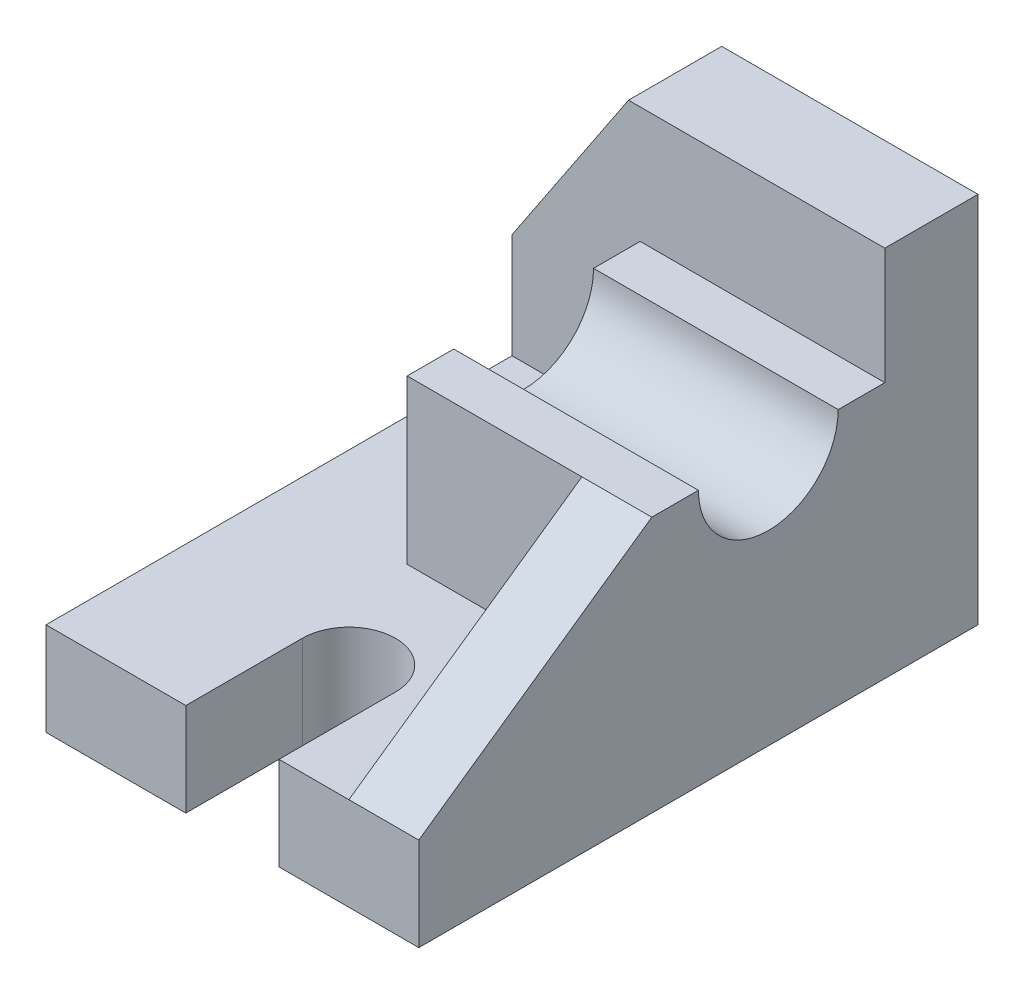
ISO-10303-21;
HEADER;
FILE_DESCRIPTION(('STEP AP214'),'2;1');
FILE_NAME('part.step','',(''),(''),'','','');
FILE_SCHEMA(('AUTOMOTIVE_DESIGN { 1 0 10303 214 1 1 1 1 }'));
ENDSEC;
DATA;
#1=APPLICATION_CONTEXT('core data for automotive mechanical design processes');
#2=APPLICATION_PROTOCOL_DEFINITION('international standard','automotive_design',2000,#1);
#3=PRODUCT_CONTEXT('',#1,'mechanical');
#4=PRODUCT('Part','Part','',(#3));
#5=PRODUCT_RELATED_PRODUCT_CATEGORY('part','',(#4));
#6=PRODUCT_DEFINITION_FORMATION('','',#4);
#7=PRODUCT_DEFINITION_CONTEXT('part definition',#1,'design');
#8=PRODUCT_DEFINITION('design','',#6,#7);
#9=PRODUCT_DEFINITION_SHAPE('','',#8);
#10=(LENGTH_UNIT() NAMED_UNIT(*) SI_UNIT(.MILLI.,.METRE.));
#11=(NAMED_UNIT(*) PLANE_ANGLE_UNIT() SI_UNIT($,.RADIAN.));
#12=(NAMED_UNIT(*) SI_UNIT($,.STERADIAN.) SOLID_ANGLE_UNIT());
#13=UNCERTAINTY_MEASURE_WITH_UNIT(LENGTH_MEASURE(1.E-05),#10,'distance_accuracy_value','');
#14=(GEOMETRIC_REPRESENTATION_CONTEXT(3) GLOBAL_UNCERTAINTY_ASSIGNED_CONTEXT((#13)) GLOBAL_UNIT_ASSIGNED_CONTEXT((#10,
#11,#12)) REPRESENTATION_CONTEXT('',''));
#15=CARTESIAN_POINT('',(0.,0.,0.));
#16=DIRECTION('',(0.,0.,1.));
#17=DIRECTION('',(1.,0.,0.));
#18=AXIS2_PLACEMENT_3D('',#15,#16,#17);
#19=CARTESIAN_POINT('',(0.,44.,0.));
#20=DIRECTION('',(0.,-1.,0.));
#21=DIRECTION('',(0.,0.,-1.));
#22=AXIS2_PLACEMENT_3D('',#19,#20,#21);
#23=PLANE('',#22);
#24=DIRECTION('',(0.,0.,1.));
#25=VECTOR('',#24,1.);
#26=CARTESIAN_POINT('',(-42.,44.,16.));
#27=LINE('',#26,#25);
#28=CARTESIAN_POINT('',(-42.,44.,16.));
#29=VERTEX_POINT('',#28);
#30=CARTESIAN_POINT('',(-42.,44.,24.));
#31=VERTEX_POINT('',#30);
#32=EDGE_CURVE('E204',#29,#31,#27,.T.);
#33=ORIENTED_EDGE('',*,*,#32,.T.);
#34=DIRECTION('',(1.,0.,0.));
#35=VECTOR('',#34,1.);
#36=CARTESIAN_POINT('',(-75.9411254969543,44.,24.));
#37=LINE('',#36,#35);
#38=CARTESIAN_POINT('',(0.,44.,24.));
#39=VERTEX_POINT('',#38);
#40=EDGE_CURVE('E11',#31,#39,#37,.T.);
#41=ORIENTED_EDGE('',*,*,#40,.T.);
#42=DIRECTION('',(0.,0.,-1.));
#43=VECTOR('',#42,1.);
#44=CARTESIAN_POINT('',(0.,44.,16.));
#45=LINE('',#44,#43);
#46=CARTESIAN_POINT('',(0.,44.,16.));
#47=VERTEX_POINT('',#46);
#48=EDGE_CURVE('E218',#39,#47,#45,.T.);
#49=ORIENTED_EDGE('',*,*,#48,.T.);
#50=DIRECTION('',(-1.,0.,0.));
#51=VECTOR('',#50,1.);
#52=CARTESIAN_POINT('',(0.,44.,16.));
#53=LINE('',#52,#51);
#54=EDGE_CURVE('E338',#47,#29,#53,.T.);
#55=ORIENTED_EDGE('',*,*,#54,.T.);
#56=EDGE_LOOP('',(#33,#41,#49,#55));
#57=FACE_BOUND('',#56,.T.);
#58=ADVANCED_FACE('F45',(#57),#23,.F.);
#59=CARTESIAN_POINT('',(-64.,16.,16.));
#60=DIRECTION('',(0.,1.,0.));
#61=DIRECTION('',(0.,0.,1.));
#62=AXIS2_PLACEMENT_3D('',#59,#60,#61);
#63=PLANE('',#62);
#64=DIRECTION('',(0.,0.,-1.));
#65=VECTOR('',#64,1.);
#66=CARTESIAN_POINT('',(-12.,16.,56.));
#67=LINE('',#66,#65);
#68=CARTESIAN_POINT('',(-12.,16.,96.));
#69=VERTEX_POINT('',#68);
#70=CARTESIAN_POINT('',(-12.,16.,56.));
#71=VERTEX_POINT('',#70);
#72=EDGE_CURVE('E178',#69,#71,#67,.T.);
#73=ORIENTED_EDGE('',*,*,#72,.T.);
#74=DIRECTION('',(1.,0.,0.));
#75=VECTOR('',#74,1.);
#76=CARTESIAN_POINT('',(0.,16.,56.));
#77=LINE('',#76,#75);
#78=CARTESIAN_POINT('',(-42.,16.,56.));
#79=VERTEX_POINT('',#78);
#80=EDGE_CURVE('E195',#79,#71,#77,.T.);
#81=ORIENTED_EDGE('',*,*,#80,.F.);
#82=DIRECTION('',(0.,0.,1.));
#83=VECTOR('',#82,1.);
#84=CARTESIAN_POINT('',(-42.,16.,16.));
#85=LINE('',#84,#83);
#86=CARTESIAN_POINT('',(-42.,16.,16.));
#87=VERTEX_POINT('',#86);
#88=EDGE_CURVE('E214',#87,#79,#85,.T.);
#89=ORIENTED_EDGE('',*,*,#88,.F.);
#90=DIRECTION('',(1.,0.,0.));
#91=VECTOR('',#90,1.);
#92=CARTESIAN_POINT('',(-64.,16.,16.));
#93=LINE('',#92,#91);
#94=CARTESIAN_POINT('',(-64.,16.,16.));
#95=VERTEX_POINT('',#94);
#96=EDGE_CURVE('E320',#95,#87,#93,.T.);
#97=ORIENTED_EDGE('',*,*,#96,.F.);
#98=DIRECTION('',(0.,0.,1.));
#99=VECTOR('',#98,1.);
#100=CARTESIAN_POINT('',(-64.,16.,16.));
#101=LINE('',#100,#99);
#102=CARTESIAN_POINT('',(-64.,16.,96.));
#103=VERTEX_POINT('',#102);
#104=EDGE_CURVE('E283',#95,#103,#101,.T.);
#105=ORIENTED_EDGE('',*,*,#104,.T.);
#106=DIRECTION('',(1.,0.,0.));
#107=VECTOR('',#106,1.);
#108=CARTESIAN_POINT('',(-64.,16.,96.));
#109=LINE('',#108,#107);
#110=CARTESIAN_POINT('',(-40.,16.,96.));
#111=VERTEX_POINT('',#110);
#112=EDGE_CURVE('E315',#103,#111,#109,.T.);
#113=ORIENTED_EDGE('',*,*,#112,.T.);
#114=DIRECTION('',(0.,0.,1.));
#115=VECTOR('',#114,1.);
#116=CARTESIAN_POINT('',(-40.,16.,96.));
#117=LINE('',#116,#115);
#118=CARTESIAN_POINT('',(-40.,16.,76.));
#119=VERTEX_POINT('',#118);
#120=EDGE_CURVE('E223',#119,#111,#117,.T.);
#121=ORIENTED_EDGE('',*,*,#120,.F.);
#122=CARTESIAN_POINT('',(-32.,16.,76.));
#123=DIRECTION('',(0.,1.,0.));
#124=DIRECTION('',(0.,0.,-1.));
#125=AXIS2_PLACEMENT_3D('',#122,#123,#124);
#126=CIRCLE('',#125,7.99999999999999);
#127=CARTESIAN_POINT('',(-24.,16.,76.));
#128=VERTEX_POINT('',#127);
#129=EDGE_CURVE('E69',#128,#119,#126,.T.);
#130=ORIENTED_EDGE('',*,*,#129,.F.);
#131=DIRECTION('',(0.,0.,-1.));
#132=VECTOR('',#131,1.);
#133=CARTESIAN_POINT('',(-24.,16.,76.));
#134=LINE('',#133,#132);
#135=CARTESIAN_POINT('',(-24.,16.,96.));
#136=VERTEX_POINT('',#135);
#137=EDGE_CURVE('E222',#136,#128,#134,.T.);
#138=ORIENTED_EDGE('',*,*,#137,.F.);
#139=EDGE_CURVE('E319',#136,#69,#109,.T.);
#140=ORIENTED_EDGE('',*,*,#139,.T.);
#141=EDGE_LOOP('',(#73,#81,#89,#97,#105,#113,#121,#130,#138,#140));
#142=FACE_BOUND('',#141,.T.);
#143=ADVANCED_FACE('F357',(#142),#63,.T.);
#144=CARTESIAN_POINT('',(-64.,64.,16.));
#145=DIRECTION('',(0.,0.,1.));
#146=DIRECTION('',(0.,-1.,0.));
#147=AXIS2_PLACEMENT_3D('',#144,#145,#146);
#148=PLANE('',#147);
#149=ORIENTED_EDGE('',*,*,#96,.T.);
#150=DIRECTION('',(0.,-1.,0.));
#151=VECTOR('',#150,1.);
#152=CARTESIAN_POINT('',(-42.,44.,16.));
#153=LINE('',#152,#151);
#154=EDGE_CURVE('E208',#29,#87,#153,.T.);
#155=ORIENTED_EDGE('',*,*,#154,.F.);
#156=ORIENTED_EDGE('',*,*,#54,.F.);
#157=DIRECTION('',(0.,-1.,0.));
#158=VECTOR('',#157,1.);
#159=CARTESIAN_POINT('',(0.,64.,16.));
#160=LINE('',#159,#158);
#161=CARTESIAN_POINT('',(0.,64.,16.));
#162=VERTEX_POINT('',#161);
#163=EDGE_CURVE('E303',#162,#47,#160,.T.);
#164=ORIENTED_EDGE('',*,*,#163,.F.);
#165=DIRECTION('',(1.,0.,0.));
#166=VECTOR('',#165,1.);
#167=CARTESIAN_POINT('',(-64.,64.,16.));
#168=LINE('',#167,#166);
#169=CARTESIAN_POINT('',(-44.,64.,16.));
#170=VERTEX_POINT('',#169);
#171=EDGE_CURVE('E324',#170,#162,#168,.T.);
#172=ORIENTED_EDGE('',*,*,#171,.F.);
#173=DIRECTION('',(0.554700196225229,0.832050294337843,0.));
#174=VECTOR('',#173,1.);
#175=CARTESIAN_POINT('',(-44.,64.,16.));
#176=LINE('',#175,#174);
#177=CARTESIAN_POINT('',(-64.,34.,16.));
#178=VERTEX_POINT('',#177);
#179=EDGE_CURVE('E256',#178,#170,#176,.T.);
#180=ORIENTED_EDGE('',*,*,#179,.F.);
#181=DIRECTION('',(0.,-1.,0.));
#182=VECTOR('',#181,1.);
#183=CARTESIAN_POINT('',(-64.,64.,16.));
#184=LINE('',#183,#182);
#185=EDGE_CURVE('E280',#178,#95,#184,.T.);
#186=ORIENTED_EDGE('',*,*,#185,.T.);
#187=EDGE_LOOP('',(#149,#155,#156,#164,#172,#180,#186));
#188=FACE_BOUND('',#187,.T.);
#189=ADVANCED_FACE('F377',(#188),#148,.T.);
#190=CARTESIAN_POINT('',(-64.,0.,96.));
#191=DIRECTION('',(0.,0.,1.));
#192=DIRECTION('',(1.,0.,0.));
#193=AXIS2_PLACEMENT_3D('',#190,#191,#192);
#194=PLANE('',#193);
#195=DIRECTION('',(0.,1.,0.));
#196=VECTOR('',#195,1.);
#197=CARTESIAN_POINT('',(-24.,-32.2490309931942,96.));
#198=LINE('',#197,#196);
#199=CARTESIAN_POINT('',(-24.,0.,96.));
#200=VERTEX_POINT('',#199);
#201=EDGE_CURVE('E249',#200,#136,#198,.T.);
#202=ORIENTED_EDGE('',*,*,#201,.F.);
#203=DIRECTION('',(1.,0.,0.));
#204=VECTOR('',#203,1.);
#205=CARTESIAN_POINT('',(-64.,0.,96.));
#206=LINE('',#205,#204);
#207=CARTESIAN_POINT('',(0.,0.,96.));
#208=VERTEX_POINT('',#207);
#209=EDGE_CURVE('E314',#200,#208,#206,.T.);
#210=ORIENTED_EDGE('',*,*,#209,.T.);
#211=DIRECTION('',(0.,-1.,0.));
#212=VECTOR('',#211,1.);
#213=CARTESIAN_POINT('',(0.,0.,96.));
#214=LINE('',#213,#212);
#215=CARTESIAN_POINT('',(0.,16.,96.));
#216=VERTEX_POINT('',#215);
#217=EDGE_CURVE('E276',#216,#208,#214,.T.);
#218=ORIENTED_EDGE('',*,*,#217,.F.);
#219=DIRECTION('',(1.,0.,0.));
#220=VECTOR('',#219,1.);
#221=CARTESIAN_POINT('',(-12.,16.,96.));
#222=LINE('',#221,#220);
#223=EDGE_CURVE('E177',#69,#216,#222,.T.);
#224=ORIENTED_EDGE('',*,*,#223,.F.);
#225=ORIENTED_EDGE('',*,*,#139,.F.);
#226=EDGE_LOOP('',(#202,#210,#218,#224,#225));
#227=FACE_BOUND('',#226,.T.);
#228=ADVANCED_FACE('F368',(#227),#194,.T.);
#229=CARTESIAN_POINT('',(-64.,0.,0.));
#230=DIRECTION('',(0.,-1.,0.));
#231=DIRECTION('',(0.,0.,-1.));
#232=AXIS2_PLACEMENT_3D('',#229,#230,#231);
#233=PLANE('',#232);
#234=DIRECTION('',(0.,0.,-1.));
#235=VECTOR('',#234,1.);
#236=CARTESIAN_POINT('',(-24.,0.,76.));
#237=LINE('',#236,#235);
#238=CARTESIAN_POINT('',(-24.,0.,76.));
#239=VERTEX_POINT('',#238);
#240=EDGE_CURVE('E226',#200,#239,#237,.T.);
#241=ORIENTED_EDGE('',*,*,#240,.T.);
#242=CARTESIAN_POINT('',(-32.,0.,76.));
#243=DIRECTION('',(0.,-1.,0.));
#244=DIRECTION('',(0.,0.,-1.));
#245=AXIS2_PLACEMENT_3D('',#242,#243,#244);
#246=CIRCLE('',#245,7.99999999999999);
#247=CARTESIAN_POINT('',(-40.,0.,76.));
#248=VERTEX_POINT('',#247);
#249=EDGE_CURVE('E242',#239,#248,#246,.F.);
#250=ORIENTED_EDGE('',*,*,#249,.T.);
#251=DIRECTION('',(0.,0.,1.));
#252=VECTOR('',#251,1.);
#253=CARTESIAN_POINT('',(-40.,0.,96.));
#254=LINE('',#253,#252);
#255=CARTESIAN_POINT('',(-40.,0.,96.));
#256=VERTEX_POINT('',#255);
#257=EDGE_CURVE('E236',#248,#256,#254,.T.);
#258=ORIENTED_EDGE('',*,*,#257,.T.);
#259=CARTESIAN_POINT('',(-64.,0.,96.));
#260=VERTEX_POINT('',#259);
#261=EDGE_CURVE('E310',#260,#256,#206,.T.);
#262=ORIENTED_EDGE('',*,*,#261,.F.);
#263=DIRECTION('',(0.,0.,-1.));
#264=VECTOR('',#263,1.);
#265=CARTESIAN_POINT('',(-64.,0.,0.));
#266=LINE('',#265,#264);
#267=CARTESIAN_POINT('',(-64.,0.,0.));
#268=VERTEX_POINT('',#267);
#269=EDGE_CURVE('E271',#260,#268,#266,.T.);
#270=ORIENTED_EDGE('',*,*,#269,.T.);
#271=DIRECTION('',(1.,0.,0.));
#272=VECTOR('',#271,1.);
#273=CARTESIAN_POINT('',(-64.,0.,0.));
#274=LINE('',#273,#272);
#275=CARTESIAN_POINT('',(0.,0.,0.));
#276=VERTEX_POINT('',#275);
#277=EDGE_CURVE('E291',#268,#276,#274,.T.);
#278=ORIENTED_EDGE('',*,*,#277,.T.);
#279=DIRECTION('',(0.,0.,-1.));
#280=VECTOR('',#279,1.);
#281=CARTESIAN_POINT('',(0.,0.,0.));
#282=LINE('',#281,#280);
#283=EDGE_CURVE('E270',#208,#276,#282,.T.);
#284=ORIENTED_EDGE('',*,*,#283,.F.);
#285=ORIENTED_EDGE('',*,*,#209,.F.);
#286=EDGE_LOOP('',(#241,#250,#258,#262,#270,#278,#284,#285));
#287=FACE_BOUND('',#286,.T.);
#288=ADVANCED_FACE('F47',(#287),#233,.T.);
#289=DIRECTION('',(0.,1.,0.));
#290=VECTOR('',#289,1.);
#291=CARTESIAN_POINT('',(-40.,-32.2490309931942,96.));
#292=LINE('',#291,#290);
#293=EDGE_CURVE('E240',#256,#111,#292,.T.);
#294=ORIENTED_EDGE('',*,*,#293,.T.);
#295=ORIENTED_EDGE('',*,*,#112,.F.);
#296=DIRECTION('',(0.,-1.,0.));
#297=VECTOR('',#296,1.);
#298=CARTESIAN_POINT('',(-64.,0.,96.));
#299=LINE('',#298,#297);
#300=EDGE_CURVE('E287',#103,#260,#299,.T.);
#301=ORIENTED_EDGE('',*,*,#300,.T.);
#302=ORIENTED_EDGE('',*,*,#261,.T.);
#303=EDGE_LOOP('',(#294,#295,#301,#302));
#304=FACE_BOUND('',#303,.T.);
#305=ADVANCED_FACE('F390',(#304),#194,.T.);
#306=CARTESIAN_POINT('',(-64.,64.,0.));
#307=DIRECTION('',(0.,1.,0.));
#308=DIRECTION('',(0.,0.,1.));
#309=AXIS2_PLACEMENT_3D('',#306,#307,#308);
#310=PLANE('',#309);
#311=DIRECTION('',(0.,0.,1.));
#312=VECTOR('',#311,1.);
#313=CARTESIAN_POINT('',(-44.,64.,-36.0555127546399));
#314=LINE('',#313,#312);
#315=CARTESIAN_POINT('',(-44.,64.,0.));
#316=VERTEX_POINT('',#315);
#317=EDGE_CURVE('E263',#316,#170,#314,.T.);
#318=ORIENTED_EDGE('',*,*,#317,.T.);
#319=ORIENTED_EDGE('',*,*,#171,.T.);
#320=DIRECTION('',(0.,0.,1.));
#321=VECTOR('',#320,1.);
#322=CARTESIAN_POINT('',(0.,64.,0.));
#323=LINE('',#322,#321);
#324=CARTESIAN_POINT('',(0.,64.,0.));
#325=VERTEX_POINT('',#324);
#326=EDGE_CURVE('E299',#325,#162,#323,.T.);
#327=ORIENTED_EDGE('',*,*,#326,.F.);
#328=DIRECTION('',(1.,0.,0.));
#329=VECTOR('',#328,1.);
#330=CARTESIAN_POINT('',(-64.,64.,0.));
#331=LINE('',#330,#329);
#332=EDGE_CURVE('E327',#316,#325,#331,.T.);
#333=ORIENTED_EDGE('',*,*,#332,.F.);
#334=EDGE_LOOP('',(#318,#319,#327,#333));
#335=FACE_BOUND('',#334,.T.);
#336=ADVANCED_FACE('F536',(#335),#310,.T.);
#337=CARTESIAN_POINT('',(-64.,0.,0.));
#338=DIRECTION('',(0.,0.,-1.));
#339=DIRECTION('',(-1.,0.,0.));
#340=AXIS2_PLACEMENT_3D('',#337,#338,#339);
#341=PLANE('',#340);
#342=DIRECTION('',(0.554700196225229,0.832050294337844,0.));
#343=VECTOR('',#342,1.);
#344=CARTESIAN_POINT('',(-44.,64.,0.));
#345=LINE('',#344,#343);
#346=CARTESIAN_POINT('',(-64.,34.,0.));
#347=VERTEX_POINT('',#346);
#348=EDGE_CURVE('E259',#347,#316,#345,.T.);
#349=ORIENTED_EDGE('',*,*,#348,.T.);
#350=ORIENTED_EDGE('',*,*,#332,.T.);
#351=DIRECTION('',(0.,1.,0.));
#352=VECTOR('',#351,1.);
#353=CARTESIAN_POINT('',(0.,0.,0.));
#354=LINE('',#353,#352);
#355=EDGE_CURVE('E295',#276,#325,#354,.T.);
#356=ORIENTED_EDGE('',*,*,#355,.F.);
#357=ORIENTED_EDGE('',*,*,#277,.F.);
#358=DIRECTION('',(0.,1.,0.));
#359=VECTOR('',#358,1.);
#360=CARTESIAN_POINT('',(-64.,0.,0.));
#361=LINE('',#360,#359);
#362=EDGE_CURVE('E275',#268,#347,#361,.T.);
#363=ORIENTED_EDGE('',*,*,#362,.T.);
#364=EDGE_LOOP('',(#349,#350,#356,#357,#363));
#365=FACE_BOUND('',#364,.T.);
#366=ADVANCED_FACE('F528',(#365),#341,.T.);
#367=CARTESIAN_POINT('',(-64.,0.,0.));
#368=DIRECTION('',(-1.,0.,0.));
#369=DIRECTION('',(0.,0.,1.));
#370=AXIS2_PLACEMENT_3D('',#367,#368,#369);
#371=PLANE('',#370);
#372=DIRECTION('',(0.,0.,1.));
#373=VECTOR('',#372,1.);
#374=CARTESIAN_POINT('',(-64.,34.,-36.0555127546399));
#375=LINE('',#374,#373);
#376=EDGE_CURVE('E267',#347,#178,#375,.T.);
#377=ORIENTED_EDGE('',*,*,#376,.F.);
#378=ORIENTED_EDGE('',*,*,#362,.F.);
#379=ORIENTED_EDGE('',*,*,#269,.F.);
#380=ORIENTED_EDGE('',*,*,#300,.F.);
#381=ORIENTED_EDGE('',*,*,#104,.F.);
#382=ORIENTED_EDGE('',*,*,#185,.F.);
#383=EDGE_LOOP('',(#377,#378,#379,#380,#381,#382));
#384=FACE_BOUND('',#383,.T.);
#385=ADVANCED_FACE('F386',(#384),#371,.T.);
#386=CARTESIAN_POINT('',(0.,0.,0.));
#387=DIRECTION('',(-1.,0.,0.));
#388=DIRECTION('',(0.,0.,1.));
#389=AXIS2_PLACEMENT_3D('',#386,#387,#388);
#390=PLANE('',#389);
#391=DIRECTION('',(0.,-0.573462344363328,0.81923192051904));
#392=VECTOR('',#391,1.);
#393=CARTESIAN_POINT('',(0.,44.,56.));
#394=LINE('',#393,#392);
#395=CARTESIAN_POINT('',(0.,44.,56.));
#396=VERTEX_POINT('',#395);
#397=EDGE_CURVE('E171',#396,#216,#394,.T.);
#398=ORIENTED_EDGE('',*,*,#397,.T.);
#399=ORIENTED_EDGE('',*,*,#217,.T.);
#400=ORIENTED_EDGE('',*,*,#283,.T.);
#401=ORIENTED_EDGE('',*,*,#355,.T.);
#402=ORIENTED_EDGE('',*,*,#326,.T.);
#403=ORIENTED_EDGE('',*,*,#163,.T.);
#404=ORIENTED_EDGE('',*,*,#48,.F.);
#405=CARTESIAN_POINT('',(0.,44.,36.));
#406=DIRECTION('',(1.,0.,0.));
#407=DIRECTION('',(0.,0.,-1.));
#408=AXIS2_PLACEMENT_3D('',#405,#406,#407);
#409=CIRCLE('',#408,12.);
#410=CARTESIAN_POINT('',(0.,44.,48.));
#411=VERTEX_POINT('',#410);
#412=EDGE_CURVE('E347',#411,#39,#409,.T.);
#413=ORIENTED_EDGE('',*,*,#412,.F.);
#414=EDGE_CURVE('E332',#396,#411,#45,.T.);
#415=ORIENTED_EDGE('',*,*,#414,.F.);
#416=EDGE_LOOP('',(#398,#399,#400,#401,#402,#403,#404,#413,#415));
#417=FACE_BOUND('',#416,.T.);
#418=ADVANCED_FACE('F372',(#417),#390,.F.);
#419=CARTESIAN_POINT('',(-44.,64.,-36.0555127546399));
#420=DIRECTION('',(0.832050294337844,-0.554700196225229,0.));
#421=DIRECTION('',(0.554700196225229,0.832050294337844,0.));
#422=AXIS2_PLACEMENT_3D('',#419,#420,#421);
#423=PLANE('',#422);
#424=ORIENTED_EDGE('',*,*,#376,.T.);
#425=ORIENTED_EDGE('',*,*,#179,.T.);
#426=ORIENTED_EDGE('',*,*,#317,.F.);
#427=ORIENTED_EDGE('',*,*,#348,.F.);
#428=EDGE_LOOP('',(#424,#425,#426,#427));
#429=FACE_BOUND('',#428,.T.);
#430=ADVANCED_FACE('F399',(#429),#423,.F.);
#431=CARTESIAN_POINT('',(-24.,-32.2490309931942,76.));
#432=DIRECTION('',(1.,0.,0.));
#433=DIRECTION('',(0.,0.,-1.));
#434=AXIS2_PLACEMENT_3D('',#431,#432,#433);
#435=PLANE('',#434);
#436=ORIENTED_EDGE('',*,*,#201,.T.);
#437=ORIENTED_EDGE('',*,*,#137,.T.);
#438=DIRECTION('',(0.,1.,0.));
#439=VECTOR('',#438,1.);
#440=CARTESIAN_POINT('',(-24.,-32.2490309931942,76.));
#441=LINE('',#440,#439);
#442=EDGE_CURVE('E235',#239,#128,#441,.T.);
#443=ORIENTED_EDGE('',*,*,#442,.F.);
#444=ORIENTED_EDGE('',*,*,#240,.F.);
#445=EDGE_LOOP('',(#436,#437,#443,#444));
#446=FACE_BOUND('',#445,.T.);
#447=ADVANCED_FACE('F397',(#446),#435,.F.);
#448=CARTESIAN_POINT('',(-32.,-32.2490309931942,76.));
#449=DIRECTION('',(0.,1.,0.));
#450=DIRECTION('',(0.,0.,1.));
#451=AXIS2_PLACEMENT_3D('',#448,#449,#450);
#452=CYLINDRICAL_SURFACE('',#451,7.99999999999999);
#453=ORIENTED_EDGE('',*,*,#442,.T.);
#454=ORIENTED_EDGE('',*,*,#129,.T.);
#455=DIRECTION('',(0.,1.,0.));
#456=VECTOR('',#455,1.);
#457=CARTESIAN_POINT('',(-40.,-32.2490309931942,76.));
#458=LINE('',#457,#456);
#459=EDGE_CURVE('E241',#248,#119,#458,.T.);
#460=ORIENTED_EDGE('',*,*,#459,.F.);
#461=ORIENTED_EDGE('',*,*,#249,.F.);
#462=EDGE_LOOP('',(#453,#454,#460,#461));
#463=FACE_BOUND('',#462,.T.);
#464=ADVANCED_FACE('F394',(#463),#452,.F.);
#465=CARTESIAN_POINT('',(-40.,-32.2490309931942,96.));
#466=DIRECTION('',(-1.,0.,0.));
#467=DIRECTION('',(0.,0.,1.));
#468=AXIS2_PLACEMENT_3D('',#465,#466,#467);
#469=PLANE('',#468);
#470=ORIENTED_EDGE('',*,*,#459,.T.);
#471=ORIENTED_EDGE('',*,*,#120,.T.);
#472=ORIENTED_EDGE('',*,*,#293,.F.);
#473=ORIENTED_EDGE('',*,*,#257,.F.);
#474=EDGE_LOOP('',(#470,#471,#472,#473));
#475=FACE_BOUND('',#474,.T.);
#476=ADVANCED_FACE('F393',(#475),#469,.F.);
#477=CARTESIAN_POINT('',(-42.,44.,16.));
#478=DIRECTION('',(1.,0.,0.));
#479=DIRECTION('',(0.,0.,-1.));
#480=AXIS2_PLACEMENT_3D('',#477,#478,#479);
#481=PLANE('',#480);
#482=CARTESIAN_POINT('',(-42.,44.,48.));
#483=VERTEX_POINT('',#482);
#484=CARTESIAN_POINT('',(-42.,44.,56.));
#485=VERTEX_POINT('',#484);
#486=EDGE_CURVE('E200',#483,#485,#27,.T.);
#487=ORIENTED_EDGE('',*,*,#486,.F.);
#488=CARTESIAN_POINT('',(-42.,44.,36.));
#489=DIRECTION('',(1.,0.,0.));
#490=DIRECTION('',(0.,0.,-1.));
#491=AXIS2_PLACEMENT_3D('',#488,#489,#490);
#492=CIRCLE('',#491,12.);
#493=EDGE_CURVE('E61',#31,#483,#492,.F.);
#494=ORIENTED_EDGE('',*,*,#493,.F.);
#495=ORIENTED_EDGE('',*,*,#32,.F.);
#496=ORIENTED_EDGE('',*,*,#154,.T.);
#497=ORIENTED_EDGE('',*,*,#88,.T.);
#498=DIRECTION('',(0.,-1.,0.));
#499=VECTOR('',#498,1.);
#500=CARTESIAN_POINT('',(-42.,44.,56.));
#501=LINE('',#500,#499);
#502=EDGE_CURVE('E203',#485,#79,#501,.T.);
#503=ORIENTED_EDGE('',*,*,#502,.F.);
#504=EDGE_LOOP('',(#487,#494,#495,#496,#497,#503));
#505=FACE_BOUND('',#504,.T.);
#506=ADVANCED_FACE('F335',(#505),#481,.F.);
#507=CARTESIAN_POINT('',(0.,44.,56.));
#508=DIRECTION('',(0.,0.,-1.));
#509=DIRECTION('',(-1.,0.,0.));
#510=AXIS2_PLACEMENT_3D('',#507,#508,#509);
#511=PLANE('',#510);
#512=ORIENTED_EDGE('',*,*,#80,.T.);
#513=DIRECTION('',(0.,1.,0.));
#514=VECTOR('',#513,1.);
#515=CARTESIAN_POINT('',(-12.,44.,56.));
#516=LINE('',#515,#514);
#517=CARTESIAN_POINT('',(-12.,44.,56.));
#518=VERTEX_POINT('',#517);
#519=EDGE_CURVE('E183',#71,#518,#516,.T.);
#520=ORIENTED_EDGE('',*,*,#519,.T.);
#521=DIRECTION('',(1.,0.,0.));
#522=VECTOR('',#521,1.);
#523=CARTESIAN_POINT('',(0.,44.,56.));
#524=LINE('',#523,#522);
#525=EDGE_CURVE('E193',#485,#518,#524,.T.);
#526=ORIENTED_EDGE('',*,*,#525,.F.);
#527=ORIENTED_EDGE('',*,*,#502,.T.);
#528=EDGE_LOOP('',(#512,#520,#526,#527));
#529=FACE_BOUND('',#528,.T.);
#530=ADVANCED_FACE('F191',(#529),#511,.F.);
#531=ORIENTED_EDGE('',*,*,#414,.T.);
#532=DIRECTION('',(1.,0.,0.));
#533=VECTOR('',#532,1.);
#534=CARTESIAN_POINT('',(-75.9411254969543,44.,48.));
#535=LINE('',#534,#533);
#536=EDGE_CURVE('E54',#411,#483,#535,.F.);
#537=ORIENTED_EDGE('',*,*,#536,.T.);
#538=ORIENTED_EDGE('',*,*,#486,.T.);
#539=ORIENTED_EDGE('',*,*,#525,.T.);
#540=DIRECTION('',(1.,0.,0.));
#541=VECTOR('',#540,1.);
#542=CARTESIAN_POINT('',(-12.,44.,56.));
#543=LINE('',#542,#541);
#544=EDGE_CURVE('E165',#518,#396,#543,.T.);
#545=ORIENTED_EDGE('',*,*,#544,.T.);
#546=EDGE_LOOP('',(#531,#537,#538,#539,#545));
#547=FACE_BOUND('',#546,.T.);
#548=ADVANCED_FACE('F198',(#547),#23,.F.);
#549=CARTESIAN_POINT('',(-75.9411254969543,44.,36.));
#550=DIRECTION('',(1.,0.,0.));
#551=DIRECTION('',(0.,0.,-1.));
#552=AXIS2_PLACEMENT_3D('',#549,#550,#551);
#553=CYLINDRICAL_SURFACE('',#552,12.);
#554=ORIENTED_EDGE('',*,*,#493,.T.);
#555=ORIENTED_EDGE('',*,*,#536,.F.);
#556=ORIENTED_EDGE('',*,*,#412,.T.);
#557=ORIENTED_EDGE('',*,*,#40,.F.);
#558=EDGE_LOOP('',(#554,#555,#556,#557));
#559=FACE_BOUND('',#558,.T.);
#560=ADVANCED_FACE('F374',(#559),#553,.F.);
#561=CARTESIAN_POINT('',(-12.,44.,56.));
#562=DIRECTION('',(0.,0.81923192051904,0.573462344363328));
#563=DIRECTION('',(0.,-0.573462344363328,0.81923192051904));
#564=AXIS2_PLACEMENT_3D('',#561,#562,#563);
#565=PLANE('',#564);
#566=ORIENTED_EDGE('',*,*,#397,.F.);
#567=ORIENTED_EDGE('',*,*,#544,.F.);
#568=DIRECTION('',(0.,-0.573462344363328,0.81923192051904));
#569=VECTOR('',#568,1.);
#570=CARTESIAN_POINT('',(-12.,44.,56.));
#571=LINE('',#570,#569);
#572=EDGE_CURVE('E168',#518,#69,#571,.T.);
#573=ORIENTED_EDGE('',*,*,#572,.T.);
#574=ORIENTED_EDGE('',*,*,#223,.T.);
#575=EDGE_LOOP('',(#566,#567,#573,#574));
#576=FACE_BOUND('',#575,.T.);
#577=ADVANCED_FACE('F167',(#576),#565,.T.);
#578=CARTESIAN_POINT('',(-12.,0.,0.));
#579=DIRECTION('',(-1.,0.,0.));
#580=DIRECTION('',(0.,0.,1.));
#581=AXIS2_PLACEMENT_3D('',#578,#579,#580);
#582=PLANE('',#581);
#583=ORIENTED_EDGE('',*,*,#519,.F.);
#584=ORIENTED_EDGE('',*,*,#72,.F.);
#585=ORIENTED_EDGE('',*,*,#572,.F.);
#586=EDGE_LOOP('',(#583,#584,#585));
#587=FACE_BOUND('',#586,.T.);
#588=ADVANCED_FACE('F182',(#587),#582,.T.);
#589=CLOSED_SHELL('',(#58,#143,#189,#228,#288,#305,#336,#366,#385,#418,#430,#447,#464,#476,#506,
#530,#548,#560,#577,#588));
#590=MANIFOLD_SOLID_BREP('B2',#589);
#591=ADVANCED_BREP_SHAPE_REPRESENTATION('',(#18,#590),#14);
#592=SHAPE_DEFINITION_REPRESENTATION(#9,#591);
ENDSEC;
END-ISO-10303-21;
